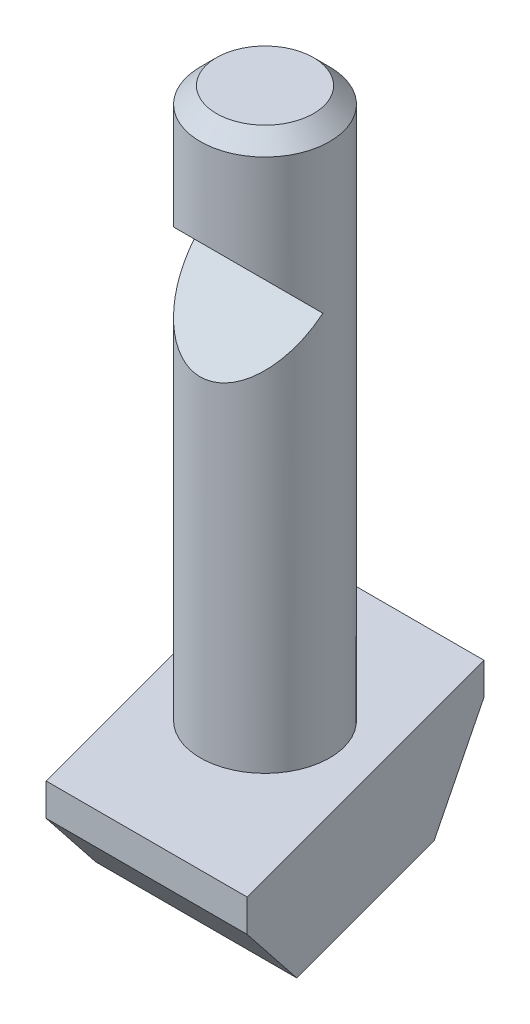
ISO-10303-21;
HEADER;
FILE_DESCRIPTION(('STEP AP214'),'2;1');
FILE_NAME('part.step','',(''),(''),'','','');
FILE_SCHEMA(('AUTOMOTIVE_DESIGN { 1 0 10303 214 1 1 1 1 }'));
ENDSEC;
DATA;
#1=APPLICATION_CONTEXT('core data for automotive mechanical design processes');
#2=APPLICATION_PROTOCOL_DEFINITION('international standard','automotive_design',2000,#1);
#3=PRODUCT_CONTEXT('',#1,'mechanical');
#4=PRODUCT('Part','Part','',(#3));
#5=PRODUCT_RELATED_PRODUCT_CATEGORY('part','',(#4));
#6=PRODUCT_DEFINITION_FORMATION('','',#4);
#7=PRODUCT_DEFINITION_CONTEXT('part definition',#1,'design');
#8=PRODUCT_DEFINITION('design','',#6,#7);
#9=PRODUCT_DEFINITION_SHAPE('','',#8);
#10=(LENGTH_UNIT() NAMED_UNIT(*) SI_UNIT(.MILLI.,.METRE.));
#11=(NAMED_UNIT(*) PLANE_ANGLE_UNIT() SI_UNIT($,.RADIAN.));
#12=(NAMED_UNIT(*) SI_UNIT($,.STERADIAN.) SOLID_ANGLE_UNIT());
#13=UNCERTAINTY_MEASURE_WITH_UNIT(LENGTH_MEASURE(1.E-05),#10,'distance_accuracy_value','');
#14=(GEOMETRIC_REPRESENTATION_CONTEXT(3) GLOBAL_UNCERTAINTY_ASSIGNED_CONTEXT((#13)) GLOBAL_UNIT_ASSIGNED_CONTEXT((#10,
#11,#12)) REPRESENTATION_CONTEXT('',''));
#15=CARTESIAN_POINT('',(0.,0.,0.));
#16=DIRECTION('',(0.,0.,1.));
#17=DIRECTION('',(1.,0.,0.));
#18=AXIS2_PLACEMENT_3D('',#15,#16,#17);
#19=CARTESIAN_POINT('',(5.,-3.5,2.9));
#20=DIRECTION('',(0.,0.643192086423274,-0.765704864789611));
#21=DIRECTION('',(0.,0.765704864789611,0.643192086423274));
#22=AXIS2_PLACEMENT_3D('',#19,#20,#21);
#23=PLANE('',#22);
#24=DIRECTION('',(1.,0.,0.));
#25=VECTOR('',#24,1.);
#26=CARTESIAN_POINT('',(5.,-3.5,2.9));
#27=LINE('',#26,#25);
#28=CARTESIAN_POINT('',(-2.32877588317999,-3.5,2.9));
#29=VERTEX_POINT('',#28);
#30=CARTESIAN_POINT('',(3.88288119928051,-3.5,2.9));
#31=VERTEX_POINT('',#30);
#32=EDGE_CURVE('E133',#29,#31,#27,.T.);
#33=ORIENTED_EDGE('',*,*,#32,.T.);
#34=DIRECTION('',(-0.169838974209492,-0.754580572446672,-0.633847680855204));
#35=VECTOR('',#34,1.);
#36=CARTESIAN_POINT('',(4.44557450338587,-1.,5.));
#37=LINE('',#36,#35);
#38=CARTESIAN_POINT('',(4.44557450338587,-1.,5.));
#39=VERTEX_POINT('',#38);
#40=EDGE_CURVE('E126',#39,#31,#37,.T.);
#41=ORIENTED_EDGE('',*,*,#40,.F.);
#42=DIRECTION('',(-1.,0.,0.));
#43=VECTOR('',#42,1.);
#44=CARTESIAN_POINT('',(5.,-1.,5.));
#45=LINE('',#44,#43);
#46=CARTESIAN_POINT('',(-1.76608257907463,-1.,5.));
#47=VERTEX_POINT('',#46);
#48=EDGE_CURVE('E114',#39,#47,#45,.T.);
#49=ORIENTED_EDGE('',*,*,#48,.T.);
#50=DIRECTION('',(0.169838974209493,0.754580572446672,0.633847680855204));
#51=VECTOR('',#50,1.);
#52=CARTESIAN_POINT('',(-2.32877588317999,-3.5,2.9));
#53=LINE('',#52,#51);
#54=EDGE_CURVE('E94',#29,#47,#53,.T.);
#55=ORIENTED_EDGE('',*,*,#54,.F.);
#56=EDGE_LOOP('',(#33,#41,#49,#55));
#57=FACE_BOUND('',#56,.T.);
#58=ADVANCED_FACE('F16',(#57),#23,.F.);
#59=CARTESIAN_POINT('',(5.,-1.,-5.));
#60=DIRECTION('',(0.,0.643192086423273,0.765704864789611));
#61=DIRECTION('',(0.,-0.765704864789611,0.643192086423273));
#62=AXIS2_PLACEMENT_3D('',#59,#60,#61);
#63=PLANE('',#62);
#64=DIRECTION('',(1.,0.,0.));
#65=VECTOR('',#64,1.);
#66=CARTESIAN_POINT('',(5.,-1.,-5.));
#67=LINE('',#66,#65);
#68=CARTESIAN_POINT('',(-4.44557450338587,-1.,-5.));
#69=VERTEX_POINT('',#68);
#70=CARTESIAN_POINT('',(1.76608257907463,-1.,-5.));
#71=VERTEX_POINT('',#70);
#72=EDGE_CURVE('E129',#69,#71,#67,.T.);
#73=ORIENTED_EDGE('',*,*,#72,.T.);
#74=DIRECTION('',(-0.169838974209492,0.754580572446671,-0.633847680855204));
#75=VECTOR('',#74,1.);
#76=CARTESIAN_POINT('',(2.32877588317999,-3.5,-2.9));
#77=LINE('',#76,#75);
#78=CARTESIAN_POINT('',(2.32877588317999,-3.5,-2.9));
#79=VERTEX_POINT('',#78);
#80=EDGE_CURVE('E120',#79,#71,#77,.T.);
#81=ORIENTED_EDGE('',*,*,#80,.F.);
#82=DIRECTION('',(1.,0.,0.));
#83=VECTOR('',#82,1.);
#84=CARTESIAN_POINT('',(5.,-3.5,-2.9));
#85=LINE('',#84,#83);
#86=CARTESIAN_POINT('',(-3.88288119928051,-3.5,-2.9));
#87=VERTEX_POINT('',#86);
#88=EDGE_CURVE('E131',#79,#87,#85,.F.);
#89=ORIENTED_EDGE('',*,*,#88,.T.);
#90=DIRECTION('',(0.169838974209492,-0.754580572446671,0.633847680855204));
#91=VECTOR('',#90,1.);
#92=CARTESIAN_POINT('',(-4.44557450338587,-1.,-5.));
#93=LINE('',#92,#91);
#94=EDGE_CURVE('E110',#69,#87,#93,.T.);
#95=ORIENTED_EDGE('',*,*,#94,.F.);
#96=EDGE_LOOP('',(#73,#81,#89,#95));
#97=FACE_BOUND('',#96,.T.);
#98=ADVANCED_FACE('F182',(#97),#63,.F.);
#99=CARTESIAN_POINT('',(5.,-3.5,-2.9));
#100=DIRECTION('',(0.,1.,0.));
#101=DIRECTION('',(0.,0.,1.));
#102=AXIS2_PLACEMENT_3D('',#99,#100,#101);
#103=PLANE('',#102);
#104=ORIENTED_EDGE('',*,*,#88,.F.);
#105=DIRECTION('',(-0.258819045102521,0.,-0.965925826289068));
#106=VECTOR('',#105,1.);
#107=CARTESIAN_POINT('',(1.76608257907463,-3.5,-5.));
#108=LINE('',#107,#106);
#109=EDGE_CURVE('E123',#31,#79,#108,.T.);
#110=ORIENTED_EDGE('',*,*,#109,.F.);
#111=ORIENTED_EDGE('',*,*,#32,.F.);
#112=DIRECTION('',(0.258819045102521,0.,0.965925826289068));
#113=VECTOR('',#112,1.);
#114=CARTESIAN_POINT('',(-4.44557450338587,-3.5,-5.));
#115=LINE('',#114,#113);
#116=EDGE_CURVE('E108',#87,#29,#115,.T.);
#117=ORIENTED_EDGE('',*,*,#116,.F.);
#118=EDGE_LOOP('',(#104,#110,#111,#117));
#119=FACE_BOUND('',#118,.T.);
#120=ADVANCED_FACE('F173',(#119),#103,.F.);
#121=CARTESIAN_POINT('',(0.,17.,0.));
#122=DIRECTION('',(0.,1.,0.));
#123=DIRECTION('',(0.,0.,1.));
#124=AXIS2_PLACEMENT_3D('',#121,#122,#123);
#125=PLANE('',#124);
#126=CARTESIAN_POINT('',(0.,16.9999999999959,0.));
#127=DIRECTION('',(0.,-1.,0.));
#128=DIRECTION('',(0.,0.,-1.));
#129=AXIS2_PLACEMENT_3D('',#126,#127,#128);
#130=CIRCLE('',#129,1.50000000002137);
#131=CARTESIAN_POINT('',(0.,16.9999999999959,-1.50000000002137));
#132=VERTEX_POINT('',#131);
#133=EDGE_CURVE('E19',#132,#132,#130,.T.);
#134=ORIENTED_EDGE('',*,*,#133,.F.);
#135=EDGE_LOOP('',(#134));
#136=FACE_BOUND('',#135,.T.);
#137=ADVANCED_FACE('F170',(#136),#125,.T.);
#138=CARTESIAN_POINT('',(5.,0.,-5.));
#139=DIRECTION('',(0.,0.,1.));
#140=DIRECTION('',(1.,0.,0.));
#141=AXIS2_PLACEMENT_3D('',#138,#139,#140);
#142=PLANE('',#141);
#143=DIRECTION('',(1.,0.,0.));
#144=VECTOR('',#143,1.);
#145=CARTESIAN_POINT('',(5.,0.,-5.));
#146=LINE('',#145,#144);
#147=CARTESIAN_POINT('',(-4.44557450338587,0.,-5.));
#148=VERTEX_POINT('',#147);
#149=CARTESIAN_POINT('',(1.76608257907463,0.,-5.));
#150=VERTEX_POINT('',#149);
#151=EDGE_CURVE('E98',#148,#150,#146,.T.);
#152=ORIENTED_EDGE('',*,*,#151,.T.);
#153=DIRECTION('',(0.,1.,0.));
#154=VECTOR('',#153,1.);
#155=CARTESIAN_POINT('',(1.76608257907463,-3.5,-5.));
#156=LINE('',#155,#154);
#157=EDGE_CURVE('E117',#71,#150,#156,.T.);
#158=ORIENTED_EDGE('',*,*,#157,.F.);
#159=ORIENTED_EDGE('',*,*,#72,.F.);
#160=DIRECTION('',(0.,1.,0.));
#161=VECTOR('',#160,1.);
#162=CARTESIAN_POINT('',(-4.44557450338587,-3.5,-5.));
#163=LINE('',#162,#161);
#164=EDGE_CURVE('E95',#148,#69,#163,.F.);
#165=ORIENTED_EDGE('',*,*,#164,.F.);
#166=EDGE_LOOP('',(#152,#158,#159,#165));
#167=FACE_BOUND('',#166,.T.);
#168=ADVANCED_FACE('F172',(#167),#142,.F.);
#169=CARTESIAN_POINT('',(1.76608257907463,-3.5,-5.));
#170=DIRECTION('',(0.965925826289068,0.,-0.258819045102521));
#171=DIRECTION('',(-0.258819045102521,0.,-0.965925826289068));
#172=AXIS2_PLACEMENT_3D('',#169,#170,#171);
#173=PLANE('',#172);
#174=DIRECTION('',(0.258819045102521,0.,0.965925826289068));
#175=VECTOR('',#174,1.);
#176=CARTESIAN_POINT('',(1.76608257907463,0.,-5.));
#177=LINE('',#176,#175);
#178=CARTESIAN_POINT('',(4.44557450338587,0.,5.));
#179=VERTEX_POINT('',#178);
#180=EDGE_CURVE('E85',#150,#179,#177,.T.);
#181=ORIENTED_EDGE('',*,*,#180,.T.);
#182=DIRECTION('',(0.,1.,0.));
#183=VECTOR('',#182,1.);
#184=CARTESIAN_POINT('',(4.44557450338587,-1.,5.));
#185=LINE('',#184,#183);
#186=EDGE_CURVE('E80',#179,#39,#185,.F.);
#187=ORIENTED_EDGE('',*,*,#186,.T.);
#188=ORIENTED_EDGE('',*,*,#40,.T.);
#189=ORIENTED_EDGE('',*,*,#109,.T.);
#190=ORIENTED_EDGE('',*,*,#80,.T.);
#191=ORIENTED_EDGE('',*,*,#157,.T.);
#192=EDGE_LOOP('',(#181,#187,#188,#189,#190,#191));
#193=FACE_BOUND('',#192,.T.);
#194=ADVANCED_FACE('F179',(#193),#173,.T.);
#195=CARTESIAN_POINT('',(5.,-1.,5.));
#196=DIRECTION('',(0.,0.,-1.));
#197=DIRECTION('',(-1.,0.,0.));
#198=AXIS2_PLACEMENT_3D('',#195,#196,#197);
#199=PLANE('',#198);
#200=ORIENTED_EDGE('',*,*,#48,.F.);
#201=ORIENTED_EDGE('',*,*,#186,.F.);
#202=DIRECTION('',(1.,0.,0.));
#203=VECTOR('',#202,1.);
#204=CARTESIAN_POINT('',(5.,0.,5.));
#205=LINE('',#204,#203);
#206=CARTESIAN_POINT('',(-1.76608257907463,0.,5.));
#207=VERTEX_POINT('',#206);
#208=EDGE_CURVE('E73',#179,#207,#205,.F.);
#209=ORIENTED_EDGE('',*,*,#208,.T.);
#210=DIRECTION('',(0.,1.,0.));
#211=VECTOR('',#210,1.);
#212=CARTESIAN_POINT('',(-1.76608257907463,-3.5,5.));
#213=LINE('',#212,#211);
#214=EDGE_CURVE('E77',#47,#207,#213,.T.);
#215=ORIENTED_EDGE('',*,*,#214,.F.);
#216=EDGE_LOOP('',(#200,#201,#209,#215));
#217=FACE_BOUND('',#216,.T.);
#218=ADVANCED_FACE('F76',(#217),#199,.F.);
#219=CARTESIAN_POINT('',(-4.44557450338587,-3.5,-5.));
#220=DIRECTION('',(-0.965925826289068,0.,0.258819045102521));
#221=DIRECTION('',(0.258819045102521,0.,0.965925826289068));
#222=AXIS2_PLACEMENT_3D('',#219,#220,#221);
#223=PLANE('',#222);
#224=ORIENTED_EDGE('',*,*,#94,.T.);
#225=ORIENTED_EDGE('',*,*,#116,.T.);
#226=ORIENTED_EDGE('',*,*,#54,.T.);
#227=ORIENTED_EDGE('',*,*,#214,.T.);
#228=DIRECTION('',(-0.258819045102521,0.,-0.965925826289068));
#229=VECTOR('',#228,1.);
#230=CARTESIAN_POINT('',(-1.76608257907463,0.,5.));
#231=LINE('',#230,#229);
#232=EDGE_CURVE('E84',#207,#148,#231,.T.);
#233=ORIENTED_EDGE('',*,*,#232,.T.);
#234=ORIENTED_EDGE('',*,*,#164,.T.);
#235=EDGE_LOOP('',(#224,#225,#226,#227,#233,#234));
#236=FACE_BOUND('',#235,.T.);
#237=ADVANCED_FACE('F90',(#236),#223,.T.);
#238=CARTESIAN_POINT('',(0.,16.5000000000077,0.));
#239=DIRECTION('',(0.,-1.,0.));
#240=DIRECTION('',(0.,0.,-1.));
#241=AXIS2_PLACEMENT_3D('',#238,#239,#240);
#242=CONICAL_SURFACE('',#241,2.00000000006639,0.785398163454292);
#243=CARTESIAN_POINT('',(0.,16.5,0.));
#244=DIRECTION('',(0.,-1.,0.));
#245=DIRECTION('',(0.,0.,-1.));
#246=AXIS2_PLACEMENT_3D('',#243,#244,#245);
#247=CIRCLE('',#246,2.);
#248=CARTESIAN_POINT('',(0.,16.5,-2.));
#249=VERTEX_POINT('',#248);
#250=EDGE_CURVE('E99',#249,#249,#247,.T.);
#251=ORIENTED_EDGE('',*,*,#250,.F.);
#252=EDGE_LOOP('',(#251));
#253=FACE_BOUND('',#252,.T.);
#254=ORIENTED_EDGE('',*,*,#133,.T.);
#255=EDGE_LOOP('',(#254));
#256=FACE_BOUND('',#255,.T.);
#257=ADVANCED_FACE('F143',(#253,#256),#242,.T.);
#258=CARTESIAN_POINT('',(-4.44557450338587,12.,0.2));
#259=DIRECTION('',(0.,0.707106781186549,-0.707106781186546));
#260=DIRECTION('',(0.,0.707106781186546,0.707106781186549));
#261=AXIS2_PLACEMENT_3D('',#258,#259,#260);
#262=PLANE('',#261);
#263=CARTESIAN_POINT('',(0.,11.8,0.));
#264=DIRECTION('',(0.,0.707106781186549,-0.707106781186546));
#265=DIRECTION('',(0.,-0.707106781186546,-0.707106781186549));
#266=AXIS2_PLACEMENT_3D('',#263,#264,#265);
#267=ELLIPSE('',#266,2.82842712474618,2.);
#268=CARTESIAN_POINT('',(-1.98997487421324,12.,0.2));
#269=VERTEX_POINT('',#268);
#270=CARTESIAN_POINT('',(1.98997487421324,12.,0.2));
#271=VERTEX_POINT('',#270);
#272=EDGE_CURVE('E102',#269,#271,#267,.T.);
#273=ORIENTED_EDGE('',*,*,#272,.F.);
#274=DIRECTION('',(1.,0.,0.));
#275=VECTOR('',#274,1.);
#276=CARTESIAN_POINT('',(-4.44557450338587,12.,0.2));
#277=LINE('',#276,#275);
#278=EDGE_CURVE('E31',#269,#271,#277,.T.);
#279=ORIENTED_EDGE('',*,*,#278,.T.);
#280=EDGE_LOOP('',(#273,#279));
#281=FACE_BOUND('',#280,.T.);
#282=ADVANCED_FACE('F140',(#281),#262,.F.);
#283=CARTESIAN_POINT('',(-4.44557450338587,10.2,2.));
#284=DIRECTION('',(0.,-0.707106781186549,-0.707106781186546));
#285=DIRECTION('',(0.,0.707106781186546,-0.707106781186549));
#286=AXIS2_PLACEMENT_3D('',#283,#284,#285);
#287=PLANE('',#286);
#288=ORIENTED_EDGE('',*,*,#278,.F.);
#289=CARTESIAN_POINT('',(0.,12.2,0.));
#290=DIRECTION('',(0.,-0.707106781186549,-0.707106781186546));
#291=DIRECTION('',(0.,-0.707106781186546,0.707106781186549));
#292=AXIS2_PLACEMENT_3D('',#289,#290,#291);
#293=ELLIPSE('',#292,2.82842712474618,2.);
#294=EDGE_CURVE('E25',#271,#269,#293,.T.);
#295=ORIENTED_EDGE('',*,*,#294,.F.);
#296=EDGE_LOOP('',(#288,#295));
#297=FACE_BOUND('',#296,.T.);
#298=ADVANCED_FACE('F142',(#297),#287,.F.);
#299=CARTESIAN_POINT('',(5.,0.,5.));
#300=DIRECTION('',(0.,-1.,0.));
#301=DIRECTION('',(0.,0.,-1.));
#302=AXIS2_PLACEMENT_3D('',#299,#300,#301);
#303=PLANE('',#302);
#304=CARTESIAN_POINT('',(0.,0.,0.));
#305=DIRECTION('',(0.,-1.,0.));
#306=DIRECTION('',(0.,0.,-1.));
#307=AXIS2_PLACEMENT_3D('',#304,#305,#306);
#308=CIRCLE('',#307,2.);
#309=CARTESIAN_POINT('',(0.,0.,-2.));
#310=VERTEX_POINT('',#309);
#311=EDGE_CURVE('E10',#310,#310,#308,.F.);
#312=ORIENTED_EDGE('',*,*,#311,.F.);
#313=EDGE_LOOP('',(#312));
#314=FACE_BOUND('',#313,.T.);
#315=ORIENTED_EDGE('',*,*,#208,.F.);
#316=ORIENTED_EDGE('',*,*,#180,.F.);
#317=ORIENTED_EDGE('',*,*,#151,.F.);
#318=ORIENTED_EDGE('',*,*,#232,.F.);
#319=EDGE_LOOP('',(#315,#316,#317,#318));
#320=FACE_BOUND('',#319,.T.);
#321=ADVANCED_FACE('F97',(#314,#320),#303,.F.);
#322=CARTESIAN_POINT('',(0.,17.,0.));
#323=DIRECTION('',(0.,-1.,0.));
#324=DIRECTION('',(0.,0.,-1.));
#325=AXIS2_PLACEMENT_3D('',#322,#323,#324);
#326=CYLINDRICAL_SURFACE('',#325,2.);
#327=ORIENTED_EDGE('',*,*,#294,.T.);
#328=ORIENTED_EDGE('',*,*,#272,.T.);
#329=EDGE_LOOP('',(#327,#328));
#330=FACE_BOUND('',#329,.T.);
#331=ORIENTED_EDGE('',*,*,#311,.T.);
#332=EDGE_LOOP('',(#331));
#333=FACE_BOUND('',#332,.T.);
#334=ORIENTED_EDGE('',*,*,#250,.T.);
#335=EDGE_LOOP('',(#334));
#336=FACE_BOUND('',#335,.T.);
#337=ADVANCED_FACE('F138',(#330,#333,#336),#326,.T.);
#338=CLOSED_SHELL('',(#58,#98,#120,#137,#168,#194,#218,#237,#257,#282,#298,#321,#337));
#339=MANIFOLD_SOLID_BREP('B1',#338);
#340=ADVANCED_BREP_SHAPE_REPRESENTATION('',(#18,#339),#14);
#341=SHAPE_DEFINITION_REPRESENTATION(#9,#340);
ENDSEC;
END-ISO-10303-21;
